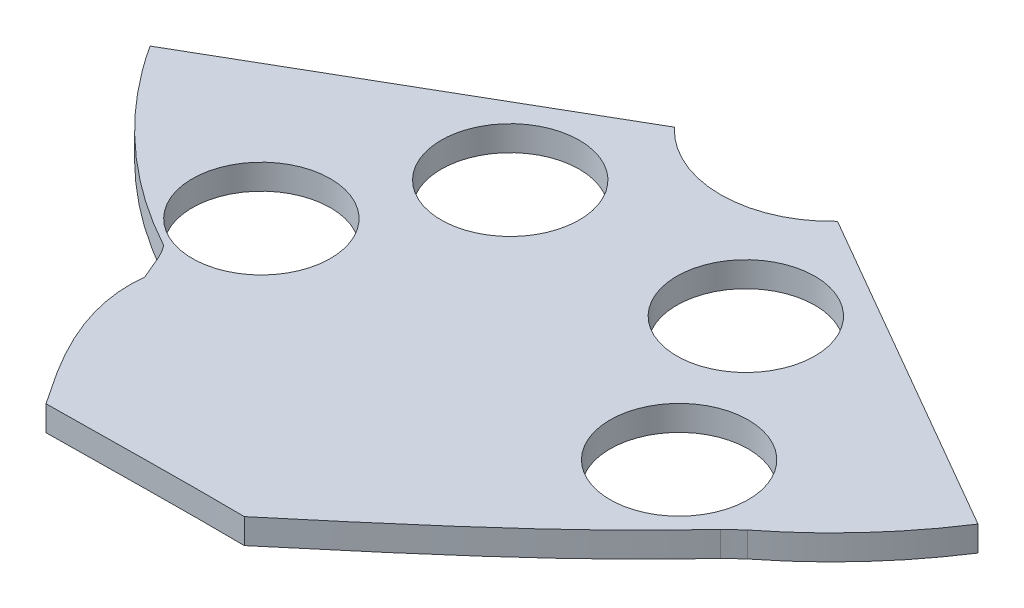
ISO-10303-21;
HEADER;
FILE_DESCRIPTION(('STEP AP214'),'2;1');
FILE_NAME('part.step','',(''),(''),'','','');
FILE_SCHEMA(('AUTOMOTIVE_DESIGN { 1 0 10303 214 1 1 1 1 }'));
ENDSEC;
DATA;
#1=APPLICATION_CONTEXT('core data for automotive mechanical design processes');
#2=APPLICATION_PROTOCOL_DEFINITION('international standard','automotive_design',2000,#1);
#3=PRODUCT_CONTEXT('',#1,'mechanical');
#4=PRODUCT('Part','Part','',(#3));
#5=PRODUCT_RELATED_PRODUCT_CATEGORY('part','',(#4));
#6=PRODUCT_DEFINITION_FORMATION('','',#4);
#7=PRODUCT_DEFINITION_CONTEXT('part definition',#1,'design');
#8=PRODUCT_DEFINITION('design','',#6,#7);
#9=PRODUCT_DEFINITION_SHAPE('','',#8);
#10=(LENGTH_UNIT() NAMED_UNIT(*) SI_UNIT(.MILLI.,.METRE.));
#11=(NAMED_UNIT(*) PLANE_ANGLE_UNIT() SI_UNIT($,.RADIAN.));
#12=(NAMED_UNIT(*) SI_UNIT($,.STERADIAN.) SOLID_ANGLE_UNIT());
#13=UNCERTAINTY_MEASURE_WITH_UNIT(LENGTH_MEASURE(1.E-05),#10,'distance_accuracy_value','');
#14=(GEOMETRIC_REPRESENTATION_CONTEXT(3) GLOBAL_UNCERTAINTY_ASSIGNED_CONTEXT((#13)) GLOBAL_UNIT_ASSIGNED_CONTEXT((#10,
#11,#12)) REPRESENTATION_CONTEXT('',''));
#15=CARTESIAN_POINT('',(0.,0.,0.));
#16=DIRECTION('',(0.,0.,1.));
#17=DIRECTION('',(1.,0.,0.));
#18=AXIS2_PLACEMENT_3D('',#15,#16,#17);
#19=CARTESIAN_POINT('',(-53.2823135310044,-83.736,57.6474314988));
#20=DIRECTION('',(0.,-1.,0.));
#21=DIRECTION('',(0.,0.,-1.));
#22=AXIS2_PLACEMENT_3D('',#19,#20,#21);
#23=PLANE('',#22);
#24=CARTESIAN_POINT('',(18.75,-83.736,32.476));
#25=DIRECTION('',(0.,-1.,0.));
#26=DIRECTION('',(0.,0.,-1.));
#27=AXIS2_PLACEMENT_3D('',#24,#25,#26);
#28=CIRCLE('',#27,10.999845998306);
#29=CARTESIAN_POINT('',(18.75,-83.736,21.476154001694));
#30=VERTEX_POINT('',#29);
#31=EDGE_CURVE('E441',#30,#30,#28,.T.);
#32=ORIENTED_EDGE('',*,*,#31,.F.);
#33=EDGE_LOOP('',(#32));
#34=FACE_BOUND('',#33,.T.);
#35=CARTESIAN_POINT('',(-33.25,-83.736,57.591));
#36=DIRECTION('',(0.,-1.,0.));
#37=DIRECTION('',(0.,0.,-1.));
#38=AXIS2_PLACEMENT_3D('',#35,#36,#37);
#39=CIRCLE('',#38,10.999845998306);
#40=CARTESIAN_POINT('',(-33.25,-83.736,46.591154001694));
#41=VERTEX_POINT('',#40);
#42=EDGE_CURVE('E422',#41,#41,#39,.T.);
#43=ORIENTED_EDGE('',*,*,#42,.F.);
#44=EDGE_LOOP('',(#43));
#45=FACE_BOUND('',#44,.T.);
#46=CARTESIAN_POINT('',(-65.8942438215736,-83.736,42.6629141284688));
#47=CARTESIAN_POINT('',(-64.1147537931954,-83.736,45.4104123729733));
#48=CARTESIAN_POINT('',(-62.1652187834539,-83.736,48.0470616335685));
#49=CARTESIAN_POINT('',(-57.9506800636168,-83.736,53.0534887504751));
#50=CARTESIAN_POINT('',(-55.6855258653653,-83.736,55.4258156097115));
#51=CARTESIAN_POINT('',(-50.8790549969829,-83.736,59.869090096533));
#52=CARTESIAN_POINT('',(-48.3373818902455,-83.736,61.9393878057703));
#53=CARTESIAN_POINT('',(-43.013721433604,-83.736,65.7477402837988));
#54=CARTESIAN_POINT('',(-40.2325930554625,-83.736,67.4858097123745));
#55=CARTESIAN_POINT('',(-37.3546868724444,-83.736,69.0429078024332));
#56=B_SPLINE_CURVE_WITH_KNOTS('',3,(#46,#47,#48,#49,#50,#51,#52,#53,#54,#55),.UNSPECIFIED.,.F.,
.F.,(4,2,2,2,4),(0.,0.25,0.5,0.75,0.999998398004469),.UNSPECIFIED.);
#57=CARTESIAN_POINT('',(-37.3546868724443,-83.736,69.0429078024333));
#58=VERTEX_POINT('',#57);
#59=CARTESIAN_POINT('',(-65.8942438215736,-83.736,42.6629141284688));
#60=VERTEX_POINT('',#59);
#61=EDGE_CURVE('E378',#58,#60,#56,.F.);
#62=ORIENTED_EDGE('',*,*,#61,.T.);
#63=DIRECTION('',(0.866025113443951,0.,-0.500000502884138));
#64=VECTOR('',#63,1.);
#65=CARTESIAN_POINT('',(-65.8942438215736,-83.736,42.6629141284688));
#66=LINE('',#65,#64);
#67=CARTESIAN_POINT('',(-12.9766531358799,-83.736,12.1108879302399));
#68=VERTEX_POINT('',#67);
#69=EDGE_CURVE('E103',#60,#68,#66,.T.);
#70=ORIENTED_EDGE('',*,*,#69,.T.);
#71=CARTESIAN_POINT('',(0.,-83.736,0.));
#72=DIRECTION('',(0.,1.,0.));
#73=DIRECTION('',(0.,0.,-1.));
#74=AXIS2_PLACEMENT_3D('',#71,#72,#73);
#75=CIRCLE('',#74,17.7501305084715);
#76=CARTESIAN_POINT('',(12.9766531358511,-83.736,12.1108879302707));
#77=VERTEX_POINT('',#76);
#78=EDGE_CURVE('E272',#68,#77,#75,.T.);
#79=ORIENTED_EDGE('',*,*,#78,.T.);
#80=DIRECTION('',(0.866025113442766,0.,0.500000502886192));
#81=VECTOR('',#80,1.);
#82=CARTESIAN_POINT('',(12.9766531358511,-83.736,12.1108879302707));
#83=LINE('',#82,#81);
#84=CARTESIAN_POINT('',(65.8946490574718,-83.736,42.6631480920524));
#85=VERTEX_POINT('',#84);
#86=EDGE_CURVE('E249',#77,#85,#83,.T.);
#87=ORIENTED_EDGE('',*,*,#86,.T.);
#88=CARTESIAN_POINT('',(48.3658696571122,-83.736,61.8295008234043));
#89=CARTESIAN_POINT('',(51.7926401134774,-83.736,59.1490750031299));
#90=CARTESIAN_POINT('',(54.9946640800136,-83.736,56.1859303052987));
#91=CARTESIAN_POINT('',(60.8643979531417,-83.736,49.7680306757699));
#92=CARTESIAN_POINT('',(63.5311693168134,-83.736,46.3139437030868));
#93=CARTESIAN_POINT('',(65.8946490574718,-83.736,42.6631480920524));
#94=B_SPLINE_CURVE_WITH_KNOTS('',3,(#88,#89,#90,#91,#92,#93),.UNSPECIFIED.,.F.,.F.,(4,2,4),(0.,
0.5,1.),.UNSPECIFIED.);
#95=CARTESIAN_POINT('',(48.3658696571122,-83.736,61.8295008234043));
#96=VERTEX_POINT('',#95);
#97=EDGE_CURVE('E244',#85,#96,#94,.F.);
#98=ORIENTED_EDGE('',*,*,#97,.T.);
#99=CARTESIAN_POINT('',(46.1422200903774,-83.736,63.8662504570901));
#100=CARTESIAN_POINT('',(46.5166547505362,-83.736,63.5193089411082));
#101=CARTESIAN_POINT('',(47.2539720635656,-83.736,62.8361345482898));
#102=CARTESIAN_POINT('',(47.9991299075482,-83.736,62.1615211907296));
#103=CARTESIAN_POINT('',(48.3658701723207,-83.736,61.8295004204075));
#104=B_SPLINE_CURVE_WITH_KNOTS('',3,(#99,#100,#101,#102,#103),.UNSPECIFIED.,.F.,.F.,(4,1,4),(0.,
0.507679894966651,0.999693663165044),.UNSPECIFIED.);
#105=CARTESIAN_POINT('',(46.1422200903774,-83.736,63.8662504570901));
#106=VERTEX_POINT('',#105);
#107=EDGE_CURVE('E321',#96,#106,#104,.F.);
#108=ORIENTED_EDGE('',*,*,#107,.T.);
#109=CARTESIAN_POINT('',(6.47057904286316,-83.736,100.031138094963));
#110=CARTESIAN_POINT('',(6.95081063424575,-83.736,99.6292804321867));
#111=CARTESIAN_POINT('',(8.9284807573999,-83.736,97.9743666204026));
#112=CARTESIAN_POINT('',(12.3362067992635,-83.736,95.110151400441));
#113=CARTESIAN_POINT('',(18.1728321690143,-83.736,90.1639274605425));
#114=CARTESIAN_POINT('',(23.8597747443914,-83.736,85.2559456913419));
#115=CARTESIAN_POINT('',(29.5693630939946,-83.736,80.1624237776796));
#116=CARTESIAN_POINT('',(33.0876874511494,-83.736,76.9305142533375));
#117=CARTESIAN_POINT('',(35.9375111051518,-83.736,74.2357631576706));
#118=CARTESIAN_POINT('',(38.0305018030483,-83.736,72.2156338987765));
#119=CARTESIAN_POINT('',(40.0677297730347,-83.736,70.2021811898875));
#120=CARTESIAN_POINT('',(41.7690017529614,-83.736,68.47874175528));
#121=CARTESIAN_POINT('',(43.1085379633111,-83.736,67.095053872102));
#122=CARTESIAN_POINT('',(44.1508631443395,-83.736,66.00231229921));
#123=CARTESIAN_POINT('',(45.1601123524483,-83.736,64.929773529188));
#124=CARTESIAN_POINT('',(45.8176873210852,-83.736,64.2176856664008));
#125=CARTESIAN_POINT('',(46.1422200903774,-83.736,63.8662504570901));
#126=B_SPLINE_CURVE_WITH_KNOTS('',3,(#109,#110,#111,#112,#113,#114,#115,#116,#117,#118,#119,
#120,#121,#122,#123,#124,#125),.UNSPECIFIED.,.F.,.F.,(4,1,1,1,1,1,1,1,1,1,1,1,1,1,4),
(-1.05589767983583E-05,0.0349594005636613,0.144001299951541,0.248588647803943,0.462212503879642,
0.563486521533681,0.675875849030411,0.728995969354997,0.782518201899197,0.838320617869871,
0.888951412699293,0.917755641625543,0.945870949224557,0.973285759254489,0.999999999999735),.UNSPECIFIED.);
#127=CARTESIAN_POINT('',(6.47057904286316,-83.736,100.031138094963));
#128=VERTEX_POINT('',#127);
#129=EDGE_CURVE('E129',#106,#128,#126,.F.);
#130=ORIENTED_EDGE('',*,*,#129,.T.);
#131=CARTESIAN_POINT('',(6.47057904286811,-83.736,100.031138094451));
#132=CARTESIAN_POINT('',(4.33612289570326,-83.736,100.011550585392));
#133=CARTESIAN_POINT('',(-5.93657041309736,-83.736,99.9528906078144));
#134=CARTESIAN_POINT('',(-16.6702335724089,-83.736,100.190968927923));
#135=CARTESIAN_POINT('',(-24.8679291600976,-83.736,100.253294127127));
#136=B_SPLINE_CURVE_WITH_KNOTS('',3,(#131,#132,#133,#134,#135),.UNSPECIFIED.,.F.,.F.,(4,1,4),
(7.9543023255705E-07,0.210061879326863,1.00000168713598),.UNSPECIFIED.);
#137=CARTESIAN_POINT('',(-24.8679291600978,-83.736,100.253294127127));
#138=VERTEX_POINT('',#137);
#139=EDGE_CURVE('E122',#128,#138,#136,.T.);
#140=ORIENTED_EDGE('',*,*,#139,.T.);
#141=CARTESIAN_POINT('',(-34.4446759631224,-83.736,74.9652465713582));
#142=CARTESIAN_POINT('',(-34.473446615681,-83.736,75.2023366850132));
#143=CARTESIAN_POINT('',(-34.5313181158808,-83.736,75.6792538719777));
#144=CARTESIAN_POINT('',(-34.5793620823417,-83.736,76.4027586999521));
#145=CARTESIAN_POINT('',(-34.6003574775647,-83.736,77.1359965081811));
#146=CARTESIAN_POINT('',(-34.59179644408,-83.736,77.8784881217621));
#147=CARTESIAN_POINT('',(-34.547002460031,-83.736,78.7892571628551));
#148=CARTESIAN_POINT('',(-34.4412300823626,-83.736,79.8752526717618));
#149=CARTESIAN_POINT('',(-34.250962995368,-83.736,81.115271828527));
#150=CARTESIAN_POINT('',(-33.9948378918696,-83.736,82.359432963548));
#151=CARTESIAN_POINT('',(-33.5785083117184,-83.736,83.9915692962229));
#152=CARTESIAN_POINT('',(-32.9274055890763,-83.736,85.9920685472631));
#153=CARTESIAN_POINT('',(-31.9826278917205,-83.736,88.3075557022546));
#154=CARTESIAN_POINT('',(-31.083448276011,-83.736,90.1755413461565));
#155=CARTESIAN_POINT('',(-30.3093027093595,-83.736,91.6371509787136));
#156=CARTESIAN_POINT('',(-29.50140081427,-83.736,93.0802755390856));
#157=CARTESIAN_POINT('',(-28.4343257992634,-83.736,94.853837337403));
#158=CARTESIAN_POINT('',(-27.0873869982827,-83.736,96.9436688536623));
#159=CARTESIAN_POINT('',(-25.8850746621888,-83.736,98.735136908401));
#160=CARTESIAN_POINT('',(-25.1455075309927,-83.736,99.8389899698536));
#161=CARTESIAN_POINT('',(-24.8679291601157,-83.736,100.253294123689));
#162=B_SPLINE_CURVE_WITH_KNOTS('',3,(#141,#142,#143,#144,#145,#146,#147,#148,#149,#150,#151,
#152,#153,#154,#155,#156,#157,#158,#159,#160,#161),.UNSPECIFIED.,.F.,.F.,(4,1,1,1,1,1,1,1,1,1,1,
1,1,1,1,1,1,1,4),(1.52933221642115E-12,0.025909013968504,0.0521170999187457,0.0786374989166976,
0.105482562685321,0.132660455682405,0.177555641607952,0.223801270911966,0.268713705528224,
0.315324359839564,0.406501916775895,0.4967066141776,0.58647614971209,0.631311074749814,
0.676149651083516,0.765907415135482,0.855831379165101,0.945887458347706,0.999996176768275),.UNSPECIFIED.);
#163=CARTESIAN_POINT('',(-34.4446759631224,-83.736,74.9652465713582));
#164=VERTEX_POINT('',#163);
#165=EDGE_CURVE('E126',#138,#164,#162,.F.);
#166=ORIENTED_EDGE('',*,*,#165,.T.);
#167=CARTESIAN_POINT('',(-37.3546868724443,-83.736,69.0429078024334));
#168=CARTESIAN_POINT('',(-37.2985083745727,-83.736,69.1138546082316));
#169=CARTESIAN_POINT('',(-37.1875126248672,-83.736,69.2540291269023));
#170=CARTESIAN_POINT('',(-37.0307066036841,-83.736,69.4676567486656));
#171=CARTESIAN_POINT('',(-36.8527705946837,-83.736,69.7241816521912));
#172=CARTESIAN_POINT('',(-36.6562820976377,-83.736,70.0312198605094));
#173=CARTESIAN_POINT('',(-36.3761316883124,-83.736,70.512355950897));
#174=CARTESIAN_POINT('',(-36.0604582474554,-83.736,71.1361497208317));
#175=CARTESIAN_POINT('',(-35.7258204642037,-83.736,71.904862585265));
#176=CARTESIAN_POINT('',(-35.4157637533987,-83.736,72.6855194561021));
#177=CARTESIAN_POINT('',(-35.1302238993612,-83.736,73.4161149224245));
#178=CARTESIAN_POINT('',(-34.8741197646008,-83.736,74.0377353969564));
#179=CARTESIAN_POINT('',(-34.6858001433551,-83.736,74.462111603718));
#180=CARTESIAN_POINT('',(-34.5488320772522,-83.736,74.7535778107033));
#181=CARTESIAN_POINT('',(-34.4808248298209,-83.736,74.8917831531983));
#182=CARTESIAN_POINT('',(-34.444675963125,-83.736,74.9652465713529));
#183=B_SPLINE_CURVE_WITH_KNOTS('',3,(#167,#168,#169,#170,#171,#172,#173,#174,#175,#176,#177,
#178,#179,#180,#181,#182),.UNSPECIFIED.,.F.,.F.,(4,1,1,1,1,1,1,1,1,1,1,1,1,4),
(0.719752849681589,0.76074392207963,0.800741750852537,0.839770303663474,0.902153147534948,
0.965810727177165,1.09191296585261,1.21856505395805,1.34548177607889,1.47239867774507,
1.57389934669321,1.65000312297301,1.68268859227008,1.7197769379735),.UNSPECIFIED.);
#184=EDGE_CURVE('E51',#164,#58,#183,.F.);
#185=ORIENTED_EDGE('',*,*,#184,.T.);
#186=EDGE_LOOP('',(#62,#70,#79,#87,#98,#108,#130,#140,#166,#185));
#187=FACE_BOUND('',#186,.T.);
#188=CARTESIAN_POINT('',(33.25,-83.736,57.591));
#189=DIRECTION('',(0.,-1.,0.));
#190=DIRECTION('',(0.,0.,-1.));
#191=AXIS2_PLACEMENT_3D('',#188,#189,#190);
#192=CIRCLE('',#191,10.999845998306);
#193=CARTESIAN_POINT('',(33.25,-83.736,46.591154001694));
#194=VERTEX_POINT('',#193);
#195=EDGE_CURVE('E429',#194,#194,#192,.T.);
#196=ORIENTED_EDGE('',*,*,#195,.F.);
#197=EDGE_LOOP('',(#196));
#198=FACE_BOUND('',#197,.T.);
#199=CARTESIAN_POINT('',(-18.75,-83.736,32.476));
#200=DIRECTION('',(0.,-1.,0.));
#201=DIRECTION('',(0.,0.,-1.));
#202=AXIS2_PLACEMENT_3D('',#199,#200,#201);
#203=CIRCLE('',#202,10.999845998306);
#204=CARTESIAN_POINT('',(-18.75,-83.736,21.476154001694));
#205=VERTEX_POINT('',#204);
#206=EDGE_CURVE('E447',#205,#205,#203,.T.);
#207=ORIENTED_EDGE('',*,*,#206,.F.);
#208=EDGE_LOOP('',(#207));
#209=FACE_BOUND('',#208,.T.);
#210=ADVANCED_FACE('F30',(#34,#45,#187,#198,#209),#23,.T.);
#211=CARTESIAN_POINT('',(-53.2823135310044,-79.736,57.6474314988));
#212=DIRECTION('',(0.,-1.,0.));
#213=DIRECTION('',(0.,0.,-1.));
#214=AXIS2_PLACEMENT_3D('',#211,#212,#213);
#215=PLANE('',#214);
#216=CARTESIAN_POINT('',(18.75,-79.736,32.476));
#217=DIRECTION('',(0.,-1.,0.));
#218=DIRECTION('',(0.,0.,-1.));
#219=AXIS2_PLACEMENT_3D('',#216,#217,#218);
#220=CIRCLE('',#219,10.999845998306);
#221=CARTESIAN_POINT('',(18.75,-79.736,21.476154001694));
#222=VERTEX_POINT('',#221);
#223=EDGE_CURVE('E444',#222,#222,#220,.T.);
#224=ORIENTED_EDGE('',*,*,#223,.T.);
#225=EDGE_LOOP('',(#224));
#226=FACE_BOUND('',#225,.T.);
#227=CARTESIAN_POINT('',(-33.25,-79.736,57.591));
#228=DIRECTION('',(0.,-1.,0.));
#229=DIRECTION('',(0.,0.,-1.));
#230=AXIS2_PLACEMENT_3D('',#227,#228,#229);
#231=CIRCLE('',#230,10.999845998306);
#232=CARTESIAN_POINT('',(-33.25,-79.736,46.591154001694));
#233=VERTEX_POINT('',#232);
#234=EDGE_CURVE('E424',#233,#233,#231,.T.);
#235=ORIENTED_EDGE('',*,*,#234,.T.);
#236=EDGE_LOOP('',(#235));
#237=FACE_BOUND('',#236,.T.);
#238=CARTESIAN_POINT('',(-37.3546868724444,-79.736,69.0429078024332));
#239=CARTESIAN_POINT('',(-40.2325930554625,-79.736,67.4858097123745));
#240=CARTESIAN_POINT('',(-43.013721433604,-79.736,65.7477402837988));
#241=CARTESIAN_POINT('',(-48.3373818902455,-79.736,61.9393878057703));
#242=CARTESIAN_POINT('',(-50.8790549969829,-79.736,59.869090096533));
#243=CARTESIAN_POINT('',(-55.6855258653653,-79.736,55.4258156097115));
#244=CARTESIAN_POINT('',(-57.9506800636168,-79.736,53.0534887504751));
#245=CARTESIAN_POINT('',(-62.1652187834539,-79.736,48.0470616335685));
#246=CARTESIAN_POINT('',(-64.1147537931954,-79.736,45.4104123729733));
#247=CARTESIAN_POINT('',(-65.8942438215736,-79.736,42.6629141284688));
#248=B_SPLINE_CURVE_WITH_KNOTS('',3,(#238,#239,#240,#241,#242,#243,#244,#245,#246,#247),
.UNSPECIFIED.,.F.,.F.,(4,2,2,2,4),(0.,0.249998398004468,0.499998398004468,0.749998398004468,
0.999998398004469),.UNSPECIFIED.);
#249=CARTESIAN_POINT('',(-37.3546868724443,-79.736,69.0429078024333));
#250=VERTEX_POINT('',#249);
#251=CARTESIAN_POINT('',(-65.8942438215736,-79.736,42.6629141284688));
#252=VERTEX_POINT('',#251);
#253=EDGE_CURVE('E405',#250,#252,#248,.T.);
#254=ORIENTED_EDGE('',*,*,#253,.F.);
#255=CARTESIAN_POINT('',(-34.444675963125,-79.736,74.9652465713529));
#256=CARTESIAN_POINT('',(-34.4808248298209,-79.736,74.8917831531983));
#257=CARTESIAN_POINT('',(-34.5488320772522,-79.736,74.7535778107033));
#258=CARTESIAN_POINT('',(-34.6858001433551,-79.736,74.462111603718));
#259=CARTESIAN_POINT('',(-34.8741197646008,-79.736,74.0377353969564));
#260=CARTESIAN_POINT('',(-35.1302238993612,-79.736,73.4161149224245));
#261=CARTESIAN_POINT('',(-35.4157637533987,-79.736,72.6855194561021));
#262=CARTESIAN_POINT('',(-35.7258204642037,-79.736,71.904862585265));
#263=CARTESIAN_POINT('',(-36.0604582474554,-79.736,71.1361497208317));
#264=CARTESIAN_POINT('',(-36.3761316883124,-79.736,70.512355950897));
#265=CARTESIAN_POINT('',(-36.6562820976377,-79.736,70.0312198605094));
#266=CARTESIAN_POINT('',(-36.8527705946837,-79.736,69.7241816521912));
#267=CARTESIAN_POINT('',(-37.0307066036841,-79.736,69.4676567486656));
#268=CARTESIAN_POINT('',(-37.1875126248672,-79.736,69.2540291269023));
#269=CARTESIAN_POINT('',(-37.2985083745727,-79.736,69.1138546082316));
#270=CARTESIAN_POINT('',(-37.3546868724443,-79.736,69.0429078024334));
#271=B_SPLINE_CURVE_WITH_KNOTS('',3,(#255,#256,#257,#258,#259,#260,#261,#262,#263,#264,#265,
#266,#267,#268,#269,#270),.UNSPECIFIED.,.F.,.F.,(4,1,1,1,1,1,1,1,1,1,1,1,1,4),
(0.719752849681589,0.756841195385011,0.789526664682083,0.865630440961882,0.967131109910019,
1.0940480115762,1.22096473369704,1.34761682180249,1.47371906047793,1.53737664012014,
1.59975948399162,1.63878803680255,1.67878586557546,1.7197769379735),.UNSPECIFIED.);
#272=CARTESIAN_POINT('',(-34.4446759631224,-79.736,74.9652465713582));
#273=VERTEX_POINT('',#272);
#274=EDGE_CURVE('E94',#273,#250,#271,.T.);
#275=ORIENTED_EDGE('',*,*,#274,.F.);
#276=CARTESIAN_POINT('',(-24.8679291601157,-79.7359999999999,100.253294123689));
#277=CARTESIAN_POINT('',(-25.1455075309927,-79.7359999999999,99.8389899698536));
#278=CARTESIAN_POINT('',(-25.8850746621888,-79.7359999999999,98.735136908401));
#279=CARTESIAN_POINT('',(-27.0873869982827,-79.7359999999999,96.9436688536623));
#280=CARTESIAN_POINT('',(-28.4343257992634,-79.7359999999999,94.853837337403));
#281=CARTESIAN_POINT('',(-29.50140081427,-79.7359999999999,93.0802755390856));
#282=CARTESIAN_POINT('',(-30.3093027093595,-79.7359999999999,91.6371509787136));
#283=CARTESIAN_POINT('',(-31.083448276011,-79.7359999999999,90.1755413461565));
#284=CARTESIAN_POINT('',(-31.9826278917205,-79.7359999999999,88.3075557022546));
#285=CARTESIAN_POINT('',(-32.9274055890763,-79.7359999999999,85.9920685472631));
#286=CARTESIAN_POINT('',(-33.5785083117184,-79.7359999999999,83.9915692962229));
#287=CARTESIAN_POINT('',(-33.9948378918696,-79.7359999999999,82.359432963548));
#288=CARTESIAN_POINT('',(-34.250962995368,-79.7359999999999,81.115271828527));
#289=CARTESIAN_POINT('',(-34.4412300823626,-79.7359999999999,79.8752526717618));
#290=CARTESIAN_POINT('',(-34.547002460031,-79.7359999999999,78.7892571628551));
#291=CARTESIAN_POINT('',(-34.59179644408,-79.7359999999999,77.8784881217621));
#292=CARTESIAN_POINT('',(-34.6003574775647,-79.7359999999999,77.1359965081811));
#293=CARTESIAN_POINT('',(-34.5793620823417,-79.7359999999999,76.4027586999521));
#294=CARTESIAN_POINT('',(-34.5313181158808,-79.7359999999999,75.6792538719777));
#295=CARTESIAN_POINT('',(-34.473446615681,-79.7359999999999,75.2023366850132));
#296=CARTESIAN_POINT('',(-34.4446759631224,-79.7359999999999,74.9652465713582));
#297=B_SPLINE_CURVE_WITH_KNOTS('',3,(#276,#277,#278,#279,#280,#281,#282,#283,#284,#285,#286,
#287,#288,#289,#290,#291,#292,#293,#294,#295,#296),.UNSPECIFIED.,.F.,.F.,(4,1,1,1,1,1,1,1,1,1,1,
1,1,1,1,1,1,1,4),(1.52928275943791E-12,0.0541087184220983,0.144164797604704,0.234088761634323,
0.323846525686289,0.36868510201999,0.413520027057714,0.503289562592204,0.59349425999391,
0.68467181693024,0.731282471241581,0.776194905857838,0.822440535161852,0.867335721087399,
0.894513614084483,0.921358677853107,0.947879076851059,0.9740871628013,0.999996176768275),.UNSPECIFIED.);
#298=CARTESIAN_POINT('',(-24.8679291600978,-79.736,100.253294127127));
#299=VERTEX_POINT('',#298);
#300=EDGE_CURVE('E87',#299,#273,#297,.T.);
#301=ORIENTED_EDGE('',*,*,#300,.F.);
#302=CARTESIAN_POINT('',(6.47057904286811,-79.736,100.031138094451));
#303=CARTESIAN_POINT('',(4.33612289570326,-79.736,100.011550585392));
#304=CARTESIAN_POINT('',(-5.93657041309736,-79.736,99.9528906078144));
#305=CARTESIAN_POINT('',(-16.6702335724089,-79.736,100.190968927923));
#306=CARTESIAN_POINT('',(-24.8679291600976,-79.736,100.253294127127));
#307=B_SPLINE_CURVE_WITH_KNOTS('',3,(#302,#303,#304,#305,#306),.UNSPECIFIED.,.F.,.F.,(4,1,4),
(7.9543023255705E-07,0.210061879326863,1.00000168713598),.UNSPECIFIED.);
#308=CARTESIAN_POINT('',(6.47057904286316,-79.736,100.031138094963));
#309=VERTEX_POINT('',#308);
#310=EDGE_CURVE('E138',#309,#299,#307,.T.);
#311=ORIENTED_EDGE('',*,*,#310,.F.);
#312=CARTESIAN_POINT('',(46.1422200903774,-79.736,63.8662504570901));
#313=CARTESIAN_POINT('',(45.8176873210852,-79.736,64.2176856664008));
#314=CARTESIAN_POINT('',(45.1601123524483,-79.736,64.929773529188));
#315=CARTESIAN_POINT('',(44.1508631443395,-79.736,66.00231229921));
#316=CARTESIAN_POINT('',(43.1085379633111,-79.736,67.095053872102));
#317=CARTESIAN_POINT('',(41.7690017529614,-79.736,68.47874175528));
#318=CARTESIAN_POINT('',(40.0677297730347,-79.736,70.2021811898875));
#319=CARTESIAN_POINT('',(38.0305018030483,-79.736,72.2156338987765));
#320=CARTESIAN_POINT('',(35.9375111051518,-79.736,74.2357631576706));
#321=CARTESIAN_POINT('',(33.0876874511494,-79.736,76.9305142533375));
#322=CARTESIAN_POINT('',(29.5693630939946,-79.736,80.1624237776796));
#323=CARTESIAN_POINT('',(23.8597747443914,-79.736,85.2559456913419));
#324=CARTESIAN_POINT('',(18.1728321690143,-79.736,90.1639274605425));
#325=CARTESIAN_POINT('',(12.3362067992635,-79.736,95.110151400441));
#326=CARTESIAN_POINT('',(8.9284807573999,-79.736,97.9743666204026));
#327=CARTESIAN_POINT('',(6.95081063424575,-79.736,99.6292804321867));
#328=CARTESIAN_POINT('',(6.47057904286316,-79.736,100.031138094963));
#329=B_SPLINE_CURVE_WITH_KNOTS('',3,(#312,#313,#314,#315,#316,#317,#318,#319,#320,#321,#322,
#323,#324,#325,#326,#327,#328),.UNSPECIFIED.,.F.,.F.,(4,1,1,1,1,1,1,1,1,1,1,1,1,1,4),
(-1.05589767983136E-05,0.0267036817684474,0.0541184917983796,0.0822337993973939,
0.111038028323643,0.161668823153066,0.217471239123739,0.27099347166794,0.324113591992526,
0.436502919489256,0.537776937143295,0.751400793218993,0.855988141071396,0.965030040459275,
0.999999999999735),.UNSPECIFIED.);
#330=CARTESIAN_POINT('',(46.1422200903774,-79.736,63.8662504570901));
#331=VERTEX_POINT('',#330);
#332=EDGE_CURVE('E312',#331,#309,#329,.T.);
#333=ORIENTED_EDGE('',*,*,#332,.F.);
#334=CARTESIAN_POINT('',(48.3658701723207,-79.7359999999999,61.8295004204075));
#335=CARTESIAN_POINT('',(47.9991299075482,-79.7359999999999,62.1615211907296));
#336=CARTESIAN_POINT('',(47.2539720635656,-79.7359999999999,62.8361345482898));
#337=CARTESIAN_POINT('',(46.5166547505362,-79.7359999999999,63.5193089411082));
#338=CARTESIAN_POINT('',(46.1422200903774,-79.7359999999999,63.8662504570901));
#339=B_SPLINE_CURVE_WITH_KNOTS('',3,(#334,#335,#336,#337,#338),.UNSPECIFIED.,.F.,.F.,(4,1,4),
(0.,0.492013768198393,0.999693663165044),.UNSPECIFIED.);
#340=CARTESIAN_POINT('',(48.3658696571122,-79.736,61.8295008234043));
#341=VERTEX_POINT('',#340);
#342=EDGE_CURVE('E327',#341,#331,#339,.T.);
#343=ORIENTED_EDGE('',*,*,#342,.F.);
#344=CARTESIAN_POINT('',(65.8946490574718,-79.736,42.6631480920524));
#345=CARTESIAN_POINT('',(63.5311693168134,-79.736,46.3139437030868));
#346=CARTESIAN_POINT('',(60.8643979531417,-79.736,49.7680306757699));
#347=CARTESIAN_POINT('',(54.9946640800136,-79.736,56.1859303052987));
#348=CARTESIAN_POINT('',(51.7926401134774,-79.736,59.1490750031299));
#349=CARTESIAN_POINT('',(48.3658696571122,-79.736,61.8295008234043));
#350=B_SPLINE_CURVE_WITH_KNOTS('',3,(#344,#345,#346,#347,#348,#349),.UNSPECIFIED.,.F.,.F.,(4,2,
4),(0.,0.5,1.),.UNSPECIFIED.);
#351=CARTESIAN_POINT('',(65.8946490574718,-79.736,42.6631480920524));
#352=VERTEX_POINT('',#351);
#353=EDGE_CURVE('E363',#352,#341,#350,.T.);
#354=ORIENTED_EDGE('',*,*,#353,.F.);
#355=DIRECTION('',(0.866025113442766,0.,0.500000502886192));
#356=VECTOR('',#355,1.);
#357=CARTESIAN_POINT('',(12.9766531358511,-79.736,12.1108879302707));
#358=LINE('',#357,#356);
#359=CARTESIAN_POINT('',(12.9766531358511,-79.736,12.1108879302707));
#360=VERTEX_POINT('',#359);
#361=EDGE_CURVE('E188',#360,#352,#358,.T.);
#362=ORIENTED_EDGE('',*,*,#361,.F.);
#363=CARTESIAN_POINT('',(0.,-79.736,0.));
#364=DIRECTION('',(0.,1.,0.));
#365=DIRECTION('',(0.,0.,-1.));
#366=AXIS2_PLACEMENT_3D('',#363,#364,#365);
#367=CIRCLE('',#366,17.7501305084715);
#368=CARTESIAN_POINT('',(-12.9766531358799,-79.736,12.1108879302399));
#369=VERTEX_POINT('',#368);
#370=EDGE_CURVE('E183',#369,#360,#367,.T.);
#371=ORIENTED_EDGE('',*,*,#370,.F.);
#372=DIRECTION('',(0.866025113443951,0.,-0.500000502884138));
#373=VECTOR('',#372,1.);
#374=CARTESIAN_POINT('',(-65.8942438215736,-79.736,42.6629141284688));
#375=LINE('',#374,#373);
#376=EDGE_CURVE('E189',#252,#369,#375,.T.);
#377=ORIENTED_EDGE('',*,*,#376,.F.);
#378=EDGE_LOOP('',(#254,#275,#301,#311,#333,#343,#354,#362,#371,#377));
#379=FACE_BOUND('',#378,.T.);
#380=CARTESIAN_POINT('',(33.25,-79.736,57.591));
#381=DIRECTION('',(0.,-1.,0.));
#382=DIRECTION('',(0.,0.,-1.));
#383=AXIS2_PLACEMENT_3D('',#380,#381,#382);
#384=CIRCLE('',#383,10.999845998306);
#385=CARTESIAN_POINT('',(33.25,-79.736,46.591154001694));
#386=VERTEX_POINT('',#385);
#387=EDGE_CURVE('E432',#386,#386,#384,.T.);
#388=ORIENTED_EDGE('',*,*,#387,.T.);
#389=EDGE_LOOP('',(#388));
#390=FACE_BOUND('',#389,.T.);
#391=CARTESIAN_POINT('',(-18.75,-79.736,32.476));
#392=DIRECTION('',(0.,-1.,0.));
#393=DIRECTION('',(0.,0.,-1.));
#394=AXIS2_PLACEMENT_3D('',#391,#392,#393);
#395=CIRCLE('',#394,10.999845998306);
#396=CARTESIAN_POINT('',(-18.75,-79.736,21.476154001694));
#397=VERTEX_POINT('',#396);
#398=EDGE_CURVE('E450',#397,#397,#395,.T.);
#399=ORIENTED_EDGE('',*,*,#398,.T.);
#400=EDGE_LOOP('',(#399));
#401=FACE_BOUND('',#400,.T.);
#402=ADVANCED_FACE('F208',(#226,#237,#379,#390,#401),#215,.F.);
#403=CARTESIAN_POINT('',(-37.3546868724444,-83.736,69.0429078024332));
#404=CARTESIAN_POINT('',(-40.2325930554625,-83.736,67.4858097123745));
#405=CARTESIAN_POINT('',(-43.013721433604,-83.736,65.7477402837988));
#406=CARTESIAN_POINT('',(-48.3373818902455,-83.736,61.9393878057703));
#407=CARTESIAN_POINT('',(-50.8790549969829,-83.736,59.869090096533));
#408=CARTESIAN_POINT('',(-55.6855258653653,-83.736,55.4258156097115));
#409=CARTESIAN_POINT('',(-57.9506800636168,-83.736,53.0534887504751));
#410=CARTESIAN_POINT('',(-62.1652187834539,-83.736,48.0470616335685));
#411=CARTESIAN_POINT('',(-64.1147537931954,-83.736,45.4104123729733));
#412=CARTESIAN_POINT('',(-65.8942438215736,-83.736,42.6629141284688));
#413=B_SPLINE_CURVE_WITH_KNOTS('',3,(#403,#404,#405,#406,#407,#408,#409,#410,#411,#412),
.UNSPECIFIED.,.F.,.F.,(4,2,2,2,4),(0.,0.249998398004468,0.499998398004468,0.749998398004468,
0.999998398004469),.UNSPECIFIED.);
#414=DIRECTION('',(0.,1.,0.));
#415=VECTOR('',#414,1.);
#416=SURFACE_OF_LINEAR_EXTRUSION('',#413,#415);
#417=ORIENTED_EDGE('',*,*,#253,.T.);
#418=DIRECTION('',(0.,1.,0.));
#419=VECTOR('',#418,1.);
#420=CARTESIAN_POINT('',(-65.8942438215736,-83.736,42.6629141284688));
#421=LINE('',#420,#419);
#422=EDGE_CURVE('E11',#60,#252,#421,.T.);
#423=ORIENTED_EDGE('',*,*,#422,.F.);
#424=ORIENTED_EDGE('',*,*,#61,.F.);
#425=DIRECTION('',(0.,1.,0.));
#426=VECTOR('',#425,1.);
#427=CARTESIAN_POINT('',(-37.3546868724443,-83.736,69.0429078024333));
#428=LINE('',#427,#426);
#429=EDGE_CURVE('E652',#58,#250,#428,.T.);
#430=ORIENTED_EDGE('',*,*,#429,.T.);
#431=EDGE_LOOP('',(#417,#423,#424,#430));
#432=FACE_BOUND('',#431,.T.);
#433=ADVANCED_FACE('F32',(#432),#416,.F.);
#434=CARTESIAN_POINT('',(-65.8942438215736,-83.736,42.6629141284688));
#435=DIRECTION('',(0.500000502884138,0.,0.866025113443951));
#436=DIRECTION('',(0.866025113443951,0.,-0.500000502884138));
#437=AXIS2_PLACEMENT_3D('',#434,#435,#436);
#438=PLANE('',#437);
#439=ORIENTED_EDGE('',*,*,#376,.T.);
#440=DIRECTION('',(0.,1.,0.));
#441=VECTOR('',#440,1.);
#442=CARTESIAN_POINT('',(-12.9766531358799,-83.736,12.1108879302399));
#443=LINE('',#442,#441);
#444=EDGE_CURVE('E42',#68,#369,#443,.T.);
#445=ORIENTED_EDGE('',*,*,#444,.F.);
#446=ORIENTED_EDGE('',*,*,#69,.F.);
#447=ORIENTED_EDGE('',*,*,#422,.T.);
#448=EDGE_LOOP('',(#439,#445,#446,#447));
#449=FACE_BOUND('',#448,.T.);
#450=ADVANCED_FACE('F469',(#449),#438,.F.);
#451=CARTESIAN_POINT('',(0.,-83.736,0.));
#452=DIRECTION('',(0.,1.,0.));
#453=DIRECTION('',(0.,0.,1.));
#454=AXIS2_PLACEMENT_3D('',#451,#452,#453);
#455=CYLINDRICAL_SURFACE('',#454,17.7501305084715);
#456=ORIENTED_EDGE('',*,*,#370,.T.);
#457=DIRECTION('',(0.,1.,0.));
#458=VECTOR('',#457,1.);
#459=CARTESIAN_POINT('',(12.9766531358511,-83.736,12.1108879302707));
#460=LINE('',#459,#458);
#461=EDGE_CURVE('E190',#77,#360,#460,.T.);
#462=ORIENTED_EDGE('',*,*,#461,.F.);
#463=ORIENTED_EDGE('',*,*,#78,.F.);
#464=ORIENTED_EDGE('',*,*,#444,.T.);
#465=EDGE_LOOP('',(#456,#462,#463,#464));
#466=FACE_BOUND('',#465,.T.);
#467=ADVANCED_FACE('F517',(#466),#455,.F.);
#468=CARTESIAN_POINT('',(12.9766531358511,-83.736,12.1108879302707));
#469=DIRECTION('',(-0.500000502886192,0.,0.866025113442766));
#470=DIRECTION('',(0.866025113442766,0.,0.500000502886192));
#471=AXIS2_PLACEMENT_3D('',#468,#469,#470);
#472=PLANE('',#471);
#473=ORIENTED_EDGE('',*,*,#361,.T.);
#474=DIRECTION('',(0.,1.,0.));
#475=VECTOR('',#474,1.);
#476=CARTESIAN_POINT('',(65.8946490574718,-83.736,42.6631480920524));
#477=LINE('',#476,#475);
#478=EDGE_CURVE('E193',#85,#352,#477,.T.);
#479=ORIENTED_EDGE('',*,*,#478,.F.);
#480=ORIENTED_EDGE('',*,*,#86,.F.);
#481=ORIENTED_EDGE('',*,*,#461,.T.);
#482=EDGE_LOOP('',(#473,#479,#480,#481));
#483=FACE_BOUND('',#482,.T.);
#484=ADVANCED_FACE('F263',(#483),#472,.F.);
#485=CARTESIAN_POINT('',(65.8946490574718,-83.736,42.6631480920524));
#486=CARTESIAN_POINT('',(63.5311693168134,-83.736,46.3139437030868));
#487=CARTESIAN_POINT('',(60.8643979531417,-83.736,49.7680306757699));
#488=CARTESIAN_POINT('',(54.9946640800136,-83.736,56.1859303052987));
#489=CARTESIAN_POINT('',(51.7926401134774,-83.736,59.1490750031299));
#490=CARTESIAN_POINT('',(48.3658696571122,-83.736,61.8295008234043));
#491=B_SPLINE_CURVE_WITH_KNOTS('',3,(#485,#486,#487,#488,#489,#490),.UNSPECIFIED.,.F.,.F.,(4,2,
4),(0.,0.5,1.),.UNSPECIFIED.);
#492=DIRECTION('',(0.,1.,0.));
#493=VECTOR('',#492,1.);
#494=SURFACE_OF_LINEAR_EXTRUSION('',#491,#493);
#495=ORIENTED_EDGE('',*,*,#353,.T.);
#496=DIRECTION('',(0.,1.,0.));
#497=VECTOR('',#496,1.);
#498=CARTESIAN_POINT('',(48.3658696571122,-83.736,61.8295008234043));
#499=LINE('',#498,#497);
#500=EDGE_CURVE('E329',#96,#341,#499,.T.);
#501=ORIENTED_EDGE('',*,*,#500,.F.);
#502=ORIENTED_EDGE('',*,*,#97,.F.);
#503=ORIENTED_EDGE('',*,*,#478,.T.);
#504=EDGE_LOOP('',(#495,#501,#502,#503));
#505=FACE_BOUND('',#504,.T.);
#506=ADVANCED_FACE('F251',(#505),#494,.F.);
#507=CARTESIAN_POINT('',(48.3658701723207,-83.736,61.8295004204075));
#508=CARTESIAN_POINT('',(47.9991299075482,-83.736,62.1615211907296));
#509=CARTESIAN_POINT('',(47.2537437243214,-83.736,62.8363412705372));
#510=CARTESIAN_POINT('',(46.516202877943,-83.736,63.5197276331351));
#511=CARTESIAN_POINT('',(46.1415422825914,-83.736,63.8668784963357));
#512=B_SPLINE_CURVE_WITH_KNOTS('',3,(#507,#508,#509,#510,#511),.UNSPECIFIED.,.F.,.F.,(4,1,4),
(0.,0.492013768198393,1.),.UNSPECIFIED.);
#513=DIRECTION('',(0.,1.,0.));
#514=VECTOR('',#513,1.);
#515=SURFACE_OF_LINEAR_EXTRUSION('',#512,#514);
#516=ORIENTED_EDGE('',*,*,#342,.T.);
#517=DIRECTION('',(0.,1.,0.));
#518=VECTOR('',#517,1.);
#519=CARTESIAN_POINT('',(46.1422200903774,-83.736,63.8662504570901));
#520=LINE('',#519,#518);
#521=EDGE_CURVE('E326',#106,#331,#520,.T.);
#522=ORIENTED_EDGE('',*,*,#521,.F.);
#523=ORIENTED_EDGE('',*,*,#107,.F.);
#524=ORIENTED_EDGE('',*,*,#500,.T.);
#525=EDGE_LOOP('',(#516,#522,#523,#524));
#526=FACE_BOUND('',#525,.T.);
#527=ADVANCED_FACE('F262',(#526),#515,.F.);
#528=CARTESIAN_POINT('',(46.1422200903774,-83.736,63.8662504570901));
#529=CARTESIAN_POINT('',(45.8176873210852,-83.736,64.2176856664008));
#530=CARTESIAN_POINT('',(45.1601123524483,-83.736,64.929773529188));
#531=CARTESIAN_POINT('',(44.1508631443395,-83.736,66.00231229921));
#532=CARTESIAN_POINT('',(43.1085379633111,-83.736,67.095053872102));
#533=CARTESIAN_POINT('',(41.7690017529614,-83.736,68.47874175528));
#534=CARTESIAN_POINT('',(40.0677297730347,-83.736,70.2021811898875));
#535=CARTESIAN_POINT('',(38.0305018030483,-83.736,72.2156338987765));
#536=CARTESIAN_POINT('',(35.9375111051518,-83.736,74.2357631576706));
#537=CARTESIAN_POINT('',(33.0876874511494,-83.736,76.9305142533375));
#538=CARTESIAN_POINT('',(29.5693630939946,-83.736,80.1624237776796));
#539=CARTESIAN_POINT('',(23.8597747443914,-83.736,85.2559456913419));
#540=CARTESIAN_POINT('',(18.1728321690143,-83.736,90.1639274605425));
#541=CARTESIAN_POINT('',(12.3362067992635,-83.736,95.110151400441));
#542=CARTESIAN_POINT('',(8.9284807573999,-83.736,97.9743666204026));
#543=CARTESIAN_POINT('',(6.95081063424575,-83.736,99.6292804321867));
#544=CARTESIAN_POINT('',(6.47057904286316,-83.736,100.031138094963));
#545=B_SPLINE_CURVE_WITH_KNOTS('',3,(#528,#529,#530,#531,#532,#533,#534,#535,#536,#537,#538,
#539,#540,#541,#542,#543,#544),.UNSPECIFIED.,.F.,.F.,(4,1,1,1,1,1,1,1,1,1,1,1,1,1,4),
(-1.05589767983136E-05,0.0267036817684474,0.0541184917983796,0.0822337993973939,
0.111038028323643,0.161668823153066,0.217471239123739,0.27099347166794,0.324113591992526,
0.436502919489256,0.537776937143295,0.751400793218993,0.855988141071396,0.965030040459275,
0.999999999999735),.UNSPECIFIED.);
#546=DIRECTION('',(0.,1.,0.));
#547=VECTOR('',#546,1.);
#548=SURFACE_OF_LINEAR_EXTRUSION('',#545,#547);
#549=ORIENTED_EDGE('',*,*,#332,.T.);
#550=DIRECTION('',(0.,1.,0.));
#551=VECTOR('',#550,1.);
#552=CARTESIAN_POINT('',(6.47057904286316,-83.736,100.031138094963));
#553=LINE('',#552,#551);
#554=EDGE_CURVE('E139',#128,#309,#553,.T.);
#555=ORIENTED_EDGE('',*,*,#554,.F.);
#556=ORIENTED_EDGE('',*,*,#129,.F.);
#557=ORIENTED_EDGE('',*,*,#521,.T.);
#558=EDGE_LOOP('',(#549,#555,#556,#557));
#559=FACE_BOUND('',#558,.T.);
#560=ADVANCED_FACE('F288',(#559),#548,.F.);
#561=DIRECTION('',(0.,1.,0.));
#562=VECTOR('',#561,1.);
#563=SURFACE_OF_LINEAR_EXTRUSION('',#136,#562);
#564=ORIENTED_EDGE('',*,*,#310,.T.);
#565=DIRECTION('',(0.,1.,0.));
#566=VECTOR('',#565,1.);
#567=CARTESIAN_POINT('',(-24.8679291600978,-83.736,100.253294127127));
#568=LINE('',#567,#566);
#569=EDGE_CURVE('E135',#138,#299,#568,.T.);
#570=ORIENTED_EDGE('',*,*,#569,.F.);
#571=ORIENTED_EDGE('',*,*,#139,.F.);
#572=ORIENTED_EDGE('',*,*,#554,.T.);
#573=EDGE_LOOP('',(#564,#570,#571,#572));
#574=FACE_BOUND('',#573,.T.);
#575=ADVANCED_FACE('F136',(#574),#563,.F.);
#576=CARTESIAN_POINT('',(-24.8679291601157,-83.736,100.253294123689));
#577=CARTESIAN_POINT('',(-25.1455075309927,-83.736,99.8389899698536));
#578=CARTESIAN_POINT('',(-25.8850746621888,-83.736,98.735136908401));
#579=CARTESIAN_POINT('',(-27.0873869982827,-83.736,96.9436688536623));
#580=CARTESIAN_POINT('',(-28.4343257992634,-83.736,94.853837337403));
#581=CARTESIAN_POINT('',(-29.50140081427,-83.736,93.0802755390856));
#582=CARTESIAN_POINT('',(-30.3093027093595,-83.736,91.6371509787136));
#583=CARTESIAN_POINT('',(-31.083448276011,-83.736,90.1755413461565));
#584=CARTESIAN_POINT('',(-31.9826278917205,-83.736,88.3075557022546));
#585=CARTESIAN_POINT('',(-32.9274055890763,-83.736,85.9920685472631));
#586=CARTESIAN_POINT('',(-33.5785083117184,-83.736,83.9915692962229));
#587=CARTESIAN_POINT('',(-33.9948378918696,-83.736,82.359432963548));
#588=CARTESIAN_POINT('',(-34.250962995368,-83.736,81.115271828527));
#589=CARTESIAN_POINT('',(-34.4412300823626,-83.736,79.8752526717618));
#590=CARTESIAN_POINT('',(-34.547002460031,-83.736,78.7892571628551));
#591=CARTESIAN_POINT('',(-34.59179644408,-83.736,77.8784881217621));
#592=CARTESIAN_POINT('',(-34.6003574775647,-83.736,77.1359965081811));
#593=CARTESIAN_POINT('',(-34.5793620823417,-83.736,76.4027586999521));
#594=CARTESIAN_POINT('',(-34.5313181158808,-83.736,75.6792538719777));
#595=CARTESIAN_POINT('',(-34.473446615681,-83.736,75.2023366850132));
#596=CARTESIAN_POINT('',(-34.4446759631224,-83.736,74.9652465713582));
#597=B_SPLINE_CURVE_WITH_KNOTS('',3,(#576,#577,#578,#579,#580,#581,#582,#583,#584,#585,#586,
#587,#588,#589,#590,#591,#592,#593,#594,#595,#596),.UNSPECIFIED.,.F.,.F.,(4,1,1,1,1,1,1,1,1,1,1,
1,1,1,1,1,1,1,4),(1.52928275943791E-12,0.0541087184220983,0.144164797604704,0.234088761634323,
0.323846525686289,0.36868510201999,0.413520027057714,0.503289562592204,0.59349425999391,
0.68467181693024,0.731282471241581,0.776194905857838,0.822440535161852,0.867335721087399,
0.894513614084483,0.921358677853107,0.947879076851059,0.9740871628013,0.999996176768275),.UNSPECIFIED.);
#598=DIRECTION('',(0.,1.,0.));
#599=VECTOR('',#598,1.);
#600=SURFACE_OF_LINEAR_EXTRUSION('',#597,#599);
#601=ORIENTED_EDGE('',*,*,#300,.T.);
#602=DIRECTION('',(0.,1.,0.));
#603=VECTOR('',#602,1.);
#604=CARTESIAN_POINT('',(-34.4446759631224,-83.736,74.9652465713582));
#605=LINE('',#604,#603);
#606=EDGE_CURVE('E140',#164,#273,#605,.T.);
#607=ORIENTED_EDGE('',*,*,#606,.F.);
#608=ORIENTED_EDGE('',*,*,#165,.F.);
#609=ORIENTED_EDGE('',*,*,#569,.T.);
#610=EDGE_LOOP('',(#601,#607,#608,#609));
#611=FACE_BOUND('',#610,.T.);
#612=ADVANCED_FACE('F143',(#611),#600,.F.);
#613=CARTESIAN_POINT('',(-1820.65663561386,-83.736,974.291396844725));
#614=CARTESIAN_POINT('',(-11.4307196413607,-83.736,88.618026568608));
#615=CARTESIAN_POINT('',(-29.7892869337878,-83.736,84.8818260178381));
#616=CARTESIAN_POINT('',(-34.6858001433551,-83.736,74.462111603718));
#617=CARTESIAN_POINT('',(-34.8741197646008,-83.736,74.0377353969564));
#618=CARTESIAN_POINT('',(-35.1302238993612,-83.736,73.4161149224245));
#619=CARTESIAN_POINT('',(-35.4157637533987,-83.736,72.6855194561021));
#620=CARTESIAN_POINT('',(-35.7258204642037,-83.736,71.904862585265));
#621=CARTESIAN_POINT('',(-36.0604582474554,-83.736,71.1361497208317));
#622=CARTESIAN_POINT('',(-36.3761316883124,-83.736,70.512355950897));
#623=CARTESIAN_POINT('',(-36.6562820976377,-83.736,70.0312198605094));
#624=CARTESIAN_POINT('',(-36.8527705946837,-83.736,69.7241816521912));
#625=CARTESIAN_POINT('',(-37.0307066036841,-83.736,69.4676567486656));
#626=CARTESIAN_POINT('',(-42.8701100120445,-83.736,61.5122360751932));
#627=CARTESIAN_POINT('',(-64.1642891857688,-83.736,65.5465261327246));
#628=CARTESIAN_POINT('',(1530.41341062973,-83.736,-1172.52830608283));
#629=B_SPLINE_CURVE_WITH_KNOTS('',3,(#613,#614,#615,#616,#617,#618,#619,#620,#621,#622,#623,
#624,#625,#626,#627,#628),.UNSPECIFIED.,.F.,.F.,(4,1,1,1,1,1,1,1,1,1,1,1,1,4),
(-4.34939210412746,0.756841195385011,0.789526664682083,0.865630440961882,0.967131109910019,
1.0940480115762,1.22096473369704,1.34761682180249,1.47371906047793,1.53737664012014,
1.59975948399162,1.63878803680255,1.67878586557546,6.06916904210099),.UNSPECIFIED.);
#630=DIRECTION('',(0.,1.,0.));
#631=VECTOR('',#630,1.);
#632=SURFACE_OF_LINEAR_EXTRUSION('',#629,#631);
#633=ORIENTED_EDGE('',*,*,#274,.T.);
#634=ORIENTED_EDGE('',*,*,#429,.F.);
#635=ORIENTED_EDGE('',*,*,#184,.F.);
#636=ORIENTED_EDGE('',*,*,#606,.T.);
#637=EDGE_LOOP('',(#633,#634,#635,#636));
#638=FACE_BOUND('',#637,.T.);
#639=ADVANCED_FACE('F163',(#638),#632,.F.);
#640=CARTESIAN_POINT('',(-33.25,-83.736,57.591));
#641=DIRECTION('',(0.,1.,0.));
#642=DIRECTION('',(0.,0.,1.));
#643=AXIS2_PLACEMENT_3D('',#640,#641,#642);
#644=CYLINDRICAL_SURFACE('',#643,10.999845998306);
#645=ORIENTED_EDGE('',*,*,#42,.T.);
#646=EDGE_LOOP('',(#645));
#647=FACE_BOUND('',#646,.T.);
#648=ORIENTED_EDGE('',*,*,#234,.F.);
#649=EDGE_LOOP('',(#648));
#650=FACE_BOUND('',#649,.T.);
#651=ADVANCED_FACE('F210',(#647,#650),#644,.F.);
#652=CARTESIAN_POINT('',(33.25,-83.736,57.591));
#653=DIRECTION('',(0.,1.,0.));
#654=DIRECTION('',(0.,0.,1.));
#655=AXIS2_PLACEMENT_3D('',#652,#653,#654);
#656=CYLINDRICAL_SURFACE('',#655,10.999845998306);
#657=ORIENTED_EDGE('',*,*,#195,.T.);
#658=EDGE_LOOP('',(#657));
#659=FACE_BOUND('',#658,.T.);
#660=ORIENTED_EDGE('',*,*,#387,.F.);
#661=EDGE_LOOP('',(#660));
#662=FACE_BOUND('',#661,.T.);
#663=ADVANCED_FACE('F475',(#659,#662),#656,.F.);
#664=CARTESIAN_POINT('',(18.75,-83.736,32.476));
#665=DIRECTION('',(0.,1.,0.));
#666=DIRECTION('',(0.,0.,1.));
#667=AXIS2_PLACEMENT_3D('',#664,#665,#666);
#668=CYLINDRICAL_SURFACE('',#667,10.999845998306);
#669=ORIENTED_EDGE('',*,*,#31,.T.);
#670=EDGE_LOOP('',(#669));
#671=FACE_BOUND('',#670,.T.);
#672=ORIENTED_EDGE('',*,*,#223,.F.);
#673=EDGE_LOOP('',(#672));
#674=FACE_BOUND('',#673,.T.);
#675=ADVANCED_FACE('F460',(#671,#674),#668,.F.);
#676=CARTESIAN_POINT('',(-18.75,-83.736,32.476));
#677=DIRECTION('',(0.,1.,0.));
#678=DIRECTION('',(0.,0.,1.));
#679=AXIS2_PLACEMENT_3D('',#676,#677,#678);
#680=CYLINDRICAL_SURFACE('',#679,10.999845998306);
#681=ORIENTED_EDGE('',*,*,#206,.T.);
#682=EDGE_LOOP('',(#681));
#683=FACE_BOUND('',#682,.T.);
#684=ORIENTED_EDGE('',*,*,#398,.F.);
#685=EDGE_LOOP('',(#684));
#686=FACE_BOUND('',#685,.T.);
#687=ADVANCED_FACE('F456',(#683,#686),#680,.F.);
#688=CLOSED_SHELL('',(#210,#402,#433,#450,#467,#484,#506,#527,#560,#575,#612,#639,#651,#663,
#675,#687));
#689=MANIFOLD_SOLID_BREP('B2',#688);
#690=ADVANCED_BREP_SHAPE_REPRESENTATION('',(#18,#689),#14);
#691=SHAPE_DEFINITION_REPRESENTATION(#9,#690);
ENDSEC;
END-ISO-10303-21;
